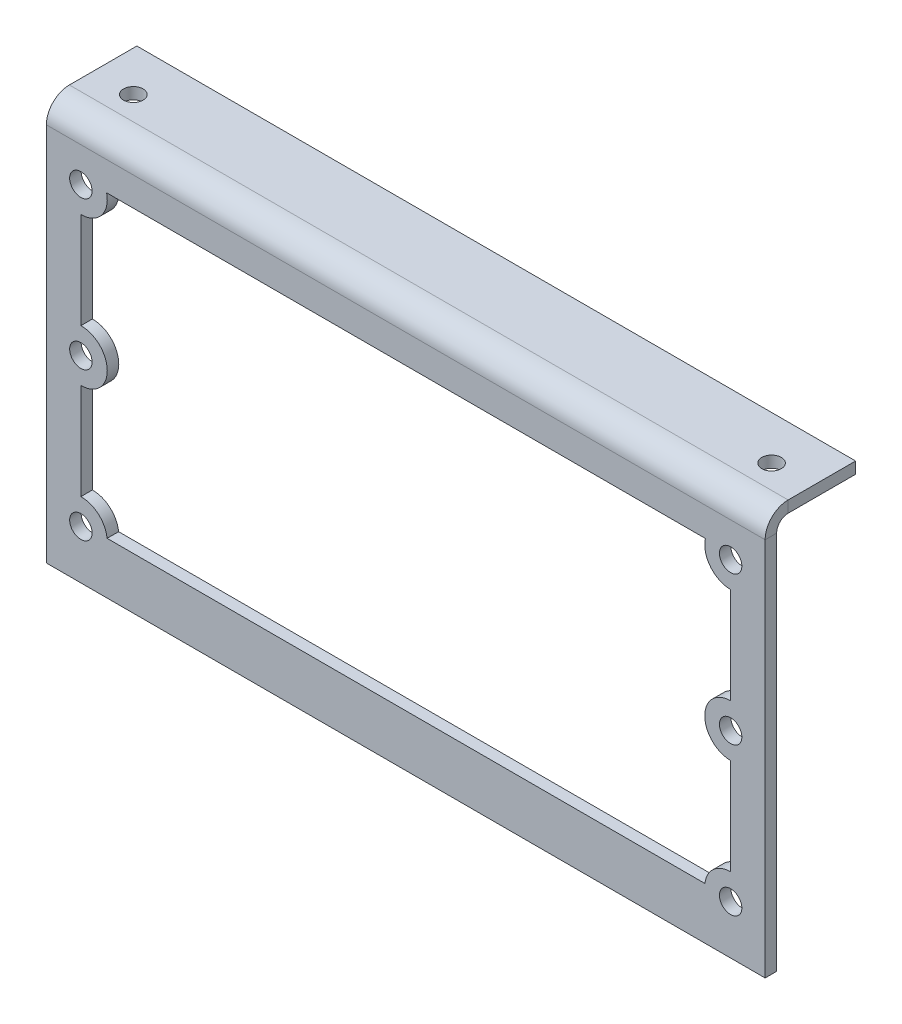
ISO-10303-21;
HEADER;
FILE_DESCRIPTION(('STEP AP214'),'2;1');
FILE_NAME('part.step','',(''),(''),'','','');
FILE_SCHEMA(('AUTOMOTIVE_DESIGN { 1 0 10303 214 1 1 1 1 }'));
ENDSEC;
DATA;
#1=APPLICATION_CONTEXT('core data for automotive mechanical design processes');
#2=APPLICATION_PROTOCOL_DEFINITION('international standard','automotive_design',2000,#1);
#3=PRODUCT_CONTEXT('',#1,'mechanical');
#4=PRODUCT('Part','Part','',(#3));
#5=PRODUCT_RELATED_PRODUCT_CATEGORY('part','',(#4));
#6=PRODUCT_DEFINITION_FORMATION('','',#4);
#7=PRODUCT_DEFINITION_CONTEXT('part definition',#1,'design');
#8=PRODUCT_DEFINITION('design','',#6,#7);
#9=PRODUCT_DEFINITION_SHAPE('','',#8);
#10=(LENGTH_UNIT() NAMED_UNIT(*) SI_UNIT(.MILLI.,.METRE.));
#11=(NAMED_UNIT(*) PLANE_ANGLE_UNIT() SI_UNIT($,.RADIAN.));
#12=(NAMED_UNIT(*) SI_UNIT($,.STERADIAN.) SOLID_ANGLE_UNIT());
#13=UNCERTAINTY_MEASURE_WITH_UNIT(LENGTH_MEASURE(1.E-05),#10,'distance_accuracy_value','');
#14=(GEOMETRIC_REPRESENTATION_CONTEXT(3) GLOBAL_UNCERTAINTY_ASSIGNED_CONTEXT((#13)) GLOBAL_UNIT_ASSIGNED_CONTEXT((#10,
#11,#12)) REPRESENTATION_CONTEXT('',''));
#15=CARTESIAN_POINT('',(0.,0.,0.));
#16=DIRECTION('',(0.,0.,1.));
#17=DIRECTION('',(1.,0.,0.));
#18=AXIS2_PLACEMENT_3D('',#15,#16,#17);
#19=CARTESIAN_POINT('',(0.,0.,0.));
#20=DIRECTION('',(0.,0.,1.));
#21=DIRECTION('',(1.,0.,0.));
#22=AXIS2_PLACEMENT_3D('',#19,#20,#21);
#23=PLANE('',#22);
#24=CARTESIAN_POINT('',(-57.2810987620652,-12.9476395905142,0.));
#25=DIRECTION('',(0.,0.,-1.));
#26=DIRECTION('',(-1.,0.,0.));
#27=AXIS2_PLACEMENT_3D('',#24,#25,#26);
#28=CIRCLE('',#27,1.95);
#29=CARTESIAN_POINT('',(-59.2310987620652,-12.9476395905142,0.));
#30=VERTEX_POINT('',#29);
#31=EDGE_CURVE('E670',#30,#30,#28,.T.);
#32=ORIENTED_EDGE('',*,*,#31,.T.);
#33=EDGE_LOOP('',(#32));
#34=FACE_BOUND('',#33,.T.);
#35=CARTESIAN_POINT('',(-57.2810987620652,12.8023604094858,0.));
#36=DIRECTION('',(0.,0.,-1.));
#37=DIRECTION('',(-1.,0.,0.));
#38=AXIS2_PLACEMENT_3D('',#35,#36,#37);
#39=CIRCLE('',#38,1.95);
#40=CARTESIAN_POINT('',(-59.2310987620652,12.8023604094858,0.));
#41=VERTEX_POINT('',#40);
#42=EDGE_CURVE('E680',#41,#41,#39,.T.);
#43=ORIENTED_EDGE('',*,*,#42,.T.);
#44=EDGE_LOOP('',(#43));
#45=FACE_BOUND('',#44,.T.);
#46=CARTESIAN_POINT('',(-57.2810987620652,38.5523604094858,0.));
#47=DIRECTION('',(0.,0.,-1.));
#48=DIRECTION('',(-1.,0.,0.));
#49=AXIS2_PLACEMENT_3D('',#46,#47,#48);
#50=CIRCLE('',#49,1.95);
#51=CARTESIAN_POINT('',(-59.2310987620652,38.5523604094858,0.));
#52=VERTEX_POINT('',#51);
#53=EDGE_CURVE('E686',#52,#52,#50,.T.);
#54=ORIENTED_EDGE('',*,*,#53,.T.);
#55=EDGE_LOOP('',(#54));
#56=FACE_BOUND('',#55,.T.);
#57=DIRECTION('',(0.,1.,0.));
#58=VECTOR('',#57,1.);
#59=CARTESIAN_POINT('',(61.7189012379343,48.5523604094752,0.));
#60=LINE('',#59,#58);
#61=CARTESIAN_POINT('',(61.7189012379343,-21.4476395905248,0.));
#62=VERTEX_POINT('',#61);
#63=CARTESIAN_POINT('',(61.7189012379343,44.5523604094752,0.));
#64=VERTEX_POINT('',#63);
#65=EDGE_CURVE('E321',#62,#64,#60,.T.);
#66=ORIENTED_EDGE('',*,*,#65,.T.);
#67=DIRECTION('',(1.,0.,0.));
#68=VECTOR('',#67,1.);
#69=CARTESIAN_POINT('',(61.7189012379343,44.5523604094752,0.));
#70=LINE('',#69,#68);
#71=CARTESIAN_POINT('',(-63.2810987620657,44.5523604094752,0.));
#72=VERTEX_POINT('',#71);
#73=EDGE_CURVE('E295',#64,#72,#70,.F.);
#74=ORIENTED_EDGE('',*,*,#73,.T.);
#75=DIRECTION('',(0.,-1.,0.));
#76=VECTOR('',#75,1.);
#77=CARTESIAN_POINT('',(-63.2810987620657,48.5523604094752,0.));
#78=LINE('',#77,#76);
#79=CARTESIAN_POINT('',(-63.2810987620657,-21.4476395905248,0.));
#80=VERTEX_POINT('',#79);
#81=EDGE_CURVE('E315',#72,#80,#78,.T.);
#82=ORIENTED_EDGE('',*,*,#81,.T.);
#83=DIRECTION('',(1.,0.,0.));
#84=VECTOR('',#83,1.);
#85=CARTESIAN_POINT('',(-63.2810987620657,-21.4476395905248,0.));
#86=LINE('',#85,#84);
#87=EDGE_CURVE('E329',#80,#62,#86,.T.);
#88=ORIENTED_EDGE('',*,*,#87,.T.);
#89=EDGE_LOOP('',(#66,#74,#82,#88));
#90=FACE_BOUND('',#89,.T.);
#91=DIRECTION('',(0.,1.,0.));
#92=VECTOR('',#91,1.);
#93=CARTESIAN_POINT('',(55.7189012379343,0.,0.));
#94=LINE('',#93,#92);
#95=CARTESIAN_POINT('',(55.7189012379343,17.3023604094752,0.));
#96=VERTEX_POINT('',#95);
#97=CARTESIAN_POINT('',(55.7189012379343,34.0523604094752,0.));
#98=VERTEX_POINT('',#97);
#99=EDGE_CURVE('E195',#96,#98,#94,.T.);
#100=ORIENTED_EDGE('',*,*,#99,.F.);
#101=CARTESIAN_POINT('',(55.7189012379344,12.8023604094752,0.));
#102=DIRECTION('',(0.,0.,1.));
#103=DIRECTION('',(1.,0.,0.));
#104=AXIS2_PLACEMENT_3D('',#101,#102,#103);
#105=CIRCLE('',#104,4.5);
#106=CARTESIAN_POINT('',(55.7189012379343,8.30236040947521,0.));
#107=VERTEX_POINT('',#106);
#108=EDGE_CURVE('E199',#96,#107,#105,.T.);
#109=ORIENTED_EDGE('',*,*,#108,.T.);
#110=CARTESIAN_POINT('',(55.7189012379343,-8.4476395905248,0.));
#111=VERTEX_POINT('',#110);
#112=EDGE_CURVE('E203',#111,#107,#94,.T.);
#113=ORIENTED_EDGE('',*,*,#112,.F.);
#114=CARTESIAN_POINT('',(55.7189012379344,-12.9476395905248,0.));
#115=DIRECTION('',(0.,0.,1.));
#116=DIRECTION('',(1.,0.,0.));
#117=AXIS2_PLACEMENT_3D('',#114,#115,#116);
#118=CIRCLE('',#117,4.5);
#119=CARTESIAN_POINT('',(51.2467652829348,-12.4476395905248,0.));
#120=VERTEX_POINT('',#119);
#121=EDGE_CURVE('E225',#111,#120,#118,.T.);
#122=ORIENTED_EDGE('',*,*,#121,.T.);
#123=DIRECTION('',(1.,0.,0.));
#124=VECTOR('',#123,1.);
#125=CARTESIAN_POINT('',(0.,-12.4476395905248,0.));
#126=LINE('',#125,#124);
#127=CARTESIAN_POINT('',(-52.7193193116163,-12.4476395905248,0.));
#128=VERTEX_POINT('',#127);
#129=EDGE_CURVE('E336',#128,#120,#126,.T.);
#130=ORIENTED_EDGE('',*,*,#129,.F.);
#131=CARTESIAN_POINT('',(-57.1914552666159,-12.9476395905248,0.));
#132=DIRECTION('',(0.,0.,1.));
#133=DIRECTION('',(1.,0.,0.));
#134=AXIS2_PLACEMENT_3D('',#131,#132,#133);
#135=CIRCLE('',#134,4.5);
#136=CARTESIAN_POINT('',(-57.2810987620657,-8.44853256315553,0.));
#137=VERTEX_POINT('',#136);
#138=EDGE_CURVE('E233',#128,#137,#135,.T.);
#139=ORIENTED_EDGE('',*,*,#138,.T.);
#140=DIRECTION('',(0.,-1.,0.));
#141=VECTOR('',#140,1.);
#142=CARTESIAN_POINT('',(-57.2810987620657,0.,0.));
#143=LINE('',#142,#141);
#144=CARTESIAN_POINT('',(-57.2810987620657,8.30325338210593,0.));
#145=VERTEX_POINT('',#144);
#146=EDGE_CURVE('E340',#145,#137,#143,.T.);
#147=ORIENTED_EDGE('',*,*,#146,.F.);
#148=CARTESIAN_POINT('',(-57.1914552666159,12.8023604094752,0.));
#149=DIRECTION('',(0.,0.,1.));
#150=DIRECTION('',(1.,0.,0.));
#151=AXIS2_PLACEMENT_3D('',#148,#149,#150);
#152=CIRCLE('',#151,4.5);
#153=CARTESIAN_POINT('',(-57.2810987620657,17.3014674368445,0.));
#154=VERTEX_POINT('',#153);
#155=EDGE_CURVE('E249',#145,#154,#152,.T.);
#156=ORIENTED_EDGE('',*,*,#155,.T.);
#157=CARTESIAN_POINT('',(-57.2810987620657,34.0532533821059,0.));
#158=VERTEX_POINT('',#157);
#159=EDGE_CURVE('E341',#158,#154,#143,.T.);
#160=ORIENTED_EDGE('',*,*,#159,.F.);
#161=CARTESIAN_POINT('',(-57.1914552666159,38.5523604094752,0.));
#162=DIRECTION('',(0.,0.,1.));
#163=DIRECTION('',(1.,0.,0.));
#164=AXIS2_PLACEMENT_3D('',#161,#162,#163);
#165=CIRCLE('',#164,4.5);
#166=CARTESIAN_POINT('',(-52.8039730729198,39.5523604094752,0.));
#167=VERTEX_POINT('',#166);
#168=EDGE_CURVE('E241',#158,#167,#165,.T.);
#169=ORIENTED_EDGE('',*,*,#168,.T.);
#170=DIRECTION('',(-1.,0.,0.));
#171=VECTOR('',#170,1.);
#172=CARTESIAN_POINT('',(0.,39.5523604094752,0.));
#173=LINE('',#172,#171);
#174=CARTESIAN_POINT('',(51.3314190442383,39.5523604094752,0.));
#175=VERTEX_POINT('',#174);
#176=EDGE_CURVE('E204',#175,#167,#173,.T.);
#177=ORIENTED_EDGE('',*,*,#176,.F.);
#178=CARTESIAN_POINT('',(55.7189012379344,38.5523604094752,0.));
#179=DIRECTION('',(0.,0.,1.));
#180=DIRECTION('',(1.,0.,0.));
#181=AXIS2_PLACEMENT_3D('',#178,#179,#180);
#182=CIRCLE('',#181,4.5);
#183=EDGE_CURVE('E201',#175,#98,#182,.T.);
#184=ORIENTED_EDGE('',*,*,#183,.T.);
#185=EDGE_LOOP('',(#100,#109,#113,#122,#130,#139,#147,#156,#160,#169,#177,#184));
#186=FACE_BOUND('',#185,.T.);
#187=CARTESIAN_POINT('',(55.7189012379349,-12.9476395905142,0.));
#188=DIRECTION('',(0.,0.,-1.));
#189=DIRECTION('',(-1.,0.,0.));
#190=AXIS2_PLACEMENT_3D('',#187,#188,#189);
#191=CIRCLE('',#190,1.95);
#192=CARTESIAN_POINT('',(53.7689012379349,-12.9476395905142,0.));
#193=VERTEX_POINT('',#192);
#194=EDGE_CURVE('E704',#193,#193,#191,.T.);
#195=ORIENTED_EDGE('',*,*,#194,.T.);
#196=EDGE_LOOP('',(#195));
#197=FACE_BOUND('',#196,.T.);
#198=CARTESIAN_POINT('',(55.7189012379349,12.8023604094858,0.));
#199=DIRECTION('',(0.,0.,-1.));
#200=DIRECTION('',(-1.,0.,0.));
#201=AXIS2_PLACEMENT_3D('',#198,#199,#200);
#202=CIRCLE('',#201,1.95);
#203=CARTESIAN_POINT('',(53.7689012379349,12.8023604094858,0.));
#204=VERTEX_POINT('',#203);
#205=EDGE_CURVE('E698',#204,#204,#202,.T.);
#206=ORIENTED_EDGE('',*,*,#205,.T.);
#207=EDGE_LOOP('',(#206));
#208=FACE_BOUND('',#207,.T.);
#209=CARTESIAN_POINT('',(55.7189012379349,38.5523604094858,0.));
#210=DIRECTION('',(0.,0.,-1.));
#211=DIRECTION('',(-1.,0.,0.));
#212=AXIS2_PLACEMENT_3D('',#209,#210,#211);
#213=CIRCLE('',#212,1.95);
#214=CARTESIAN_POINT('',(53.7689012379349,38.5523604094858,0.));
#215=VERTEX_POINT('',#214);
#216=EDGE_CURVE('E692',#215,#215,#213,.T.);
#217=ORIENTED_EDGE('',*,*,#216,.T.);
#218=EDGE_LOOP('',(#217));
#219=FACE_BOUND('',#218,.T.);
#220=ADVANCED_FACE('F59',(#34,#45,#56,#90,#186,#197,#208,#219),#23,.T.);
#221=CARTESIAN_POINT('',(0.,0.,-2.));
#222=DIRECTION('',(0.,0.,1.));
#223=DIRECTION('',(1.,0.,0.));
#224=AXIS2_PLACEMENT_3D('',#221,#222,#223);
#225=PLANE('',#224);
#226=CARTESIAN_POINT('',(-57.2810987620652,-12.9476395905142,-1.99999999999945));
#227=DIRECTION('',(0.,0.,-1.));
#228=DIRECTION('',(-1.,0.,0.));
#229=AXIS2_PLACEMENT_3D('',#226,#227,#228);
#230=CIRCLE('',#229,1.95);
#231=CARTESIAN_POINT('',(-59.2310987620652,-12.9476395905142,-1.99999999999945));
#232=VERTEX_POINT('',#231);
#233=EDGE_CURVE('E673',#232,#232,#230,.T.);
#234=ORIENTED_EDGE('',*,*,#233,.F.);
#235=EDGE_LOOP('',(#234));
#236=FACE_BOUND('',#235,.T.);
#237=CARTESIAN_POINT('',(-57.2810987620652,12.8023604094858,-1.99999999999945));
#238=DIRECTION('',(0.,0.,-1.));
#239=DIRECTION('',(-1.,0.,0.));
#240=AXIS2_PLACEMENT_3D('',#237,#238,#239);
#241=CIRCLE('',#240,1.95);
#242=CARTESIAN_POINT('',(-59.2310987620652,12.8023604094858,-1.99999999999945));
#243=VERTEX_POINT('',#242);
#244=EDGE_CURVE('E675',#243,#243,#241,.T.);
#245=ORIENTED_EDGE('',*,*,#244,.F.);
#246=EDGE_LOOP('',(#245));
#247=FACE_BOUND('',#246,.T.);
#248=CARTESIAN_POINT('',(-57.2810987620652,38.5523604094858,-1.99999999999945));
#249=DIRECTION('',(0.,0.,-1.));
#250=DIRECTION('',(-1.,0.,0.));
#251=AXIS2_PLACEMENT_3D('',#248,#249,#250);
#252=CIRCLE('',#251,1.95);
#253=CARTESIAN_POINT('',(-59.2310987620652,38.5523604094858,-1.99999999999945));
#254=VERTEX_POINT('',#253);
#255=EDGE_CURVE('E683',#254,#254,#252,.T.);
#256=ORIENTED_EDGE('',*,*,#255,.F.);
#257=EDGE_LOOP('',(#256));
#258=FACE_BOUND('',#257,.T.);
#259=CARTESIAN_POINT('',(55.7189012379349,38.5523604094858,-1.99999999999945));
#260=DIRECTION('',(0.,0.,-1.));
#261=DIRECTION('',(-1.,0.,0.));
#262=AXIS2_PLACEMENT_3D('',#259,#260,#261);
#263=CIRCLE('',#262,1.95);
#264=CARTESIAN_POINT('',(53.7689012379349,38.5523604094858,-1.99999999999945));
#265=VERTEX_POINT('',#264);
#266=EDGE_CURVE('E689',#265,#265,#263,.T.);
#267=ORIENTED_EDGE('',*,*,#266,.F.);
#268=EDGE_LOOP('',(#267));
#269=FACE_BOUND('',#268,.T.);
#270=CARTESIAN_POINT('',(55.7189012379349,12.8023604094858,-1.99999999999945));
#271=DIRECTION('',(0.,0.,-1.));
#272=DIRECTION('',(-1.,0.,0.));
#273=AXIS2_PLACEMENT_3D('',#270,#271,#272);
#274=CIRCLE('',#273,1.95);
#275=CARTESIAN_POINT('',(53.7689012379349,12.8023604094858,-1.99999999999945));
#276=VERTEX_POINT('',#275);
#277=EDGE_CURVE('E695',#276,#276,#274,.T.);
#278=ORIENTED_EDGE('',*,*,#277,.F.);
#279=EDGE_LOOP('',(#278));
#280=FACE_BOUND('',#279,.T.);
#281=DIRECTION('',(0.,-1.,0.));
#282=VECTOR('',#281,1.);
#283=CARTESIAN_POINT('',(55.7189012379343,39.5523604094752,-2.00000000000089));
#284=LINE('',#283,#282);
#285=CARTESIAN_POINT('',(55.7189012379343,8.30236040947521,-2.00000000000089));
#286=VERTEX_POINT('',#285);
#287=CARTESIAN_POINT('',(55.7189012379343,-8.4476395905248,-2.00000000000089));
#288=VERTEX_POINT('',#287);
#289=EDGE_CURVE('E253',#286,#288,#284,.T.);
#290=ORIENTED_EDGE('',*,*,#289,.F.);
#291=CARTESIAN_POINT('',(55.7189012379344,12.8023604094752,-2.));
#292=DIRECTION('',(0.,0.,1.));
#293=DIRECTION('',(1.,0.,0.));
#294=AXIS2_PLACEMENT_3D('',#291,#292,#293);
#295=CIRCLE('',#294,4.5);
#296=CARTESIAN_POINT('',(55.7189012379343,17.3023604094752,-2.00000000000089));
#297=VERTEX_POINT('',#296);
#298=EDGE_CURVE('E211',#297,#286,#295,.T.);
#299=ORIENTED_EDGE('',*,*,#298,.F.);
#300=CARTESIAN_POINT('',(55.7189012379343,34.0523604094752,-2.00000000000089));
#301=VERTEX_POINT('',#300);
#302=EDGE_CURVE('E80',#301,#297,#284,.T.);
#303=ORIENTED_EDGE('',*,*,#302,.F.);
#304=CARTESIAN_POINT('',(55.7189012379344,38.5523604094752,-2.));
#305=DIRECTION('',(0.,0.,1.));
#306=DIRECTION('',(1.,0.,0.));
#307=AXIS2_PLACEMENT_3D('',#304,#305,#306);
#308=CIRCLE('',#307,4.5);
#309=CARTESIAN_POINT('',(51.3314190442383,39.5523604094752,-2.00000000000089));
#310=VERTEX_POINT('',#309);
#311=EDGE_CURVE('E219',#310,#301,#308,.T.);
#312=ORIENTED_EDGE('',*,*,#311,.F.);
#313=DIRECTION('',(1.,0.,0.));
#314=VECTOR('',#313,1.);
#315=CARTESIAN_POINT('',(55.7189012379343,39.5523604094752,-2.00000000000089));
#316=LINE('',#315,#314);
#317=CARTESIAN_POINT('',(-52.8039730729198,39.5523604094752,-2.00000000000089));
#318=VERTEX_POINT('',#317);
#319=EDGE_CURVE('E262',#318,#310,#316,.T.);
#320=ORIENTED_EDGE('',*,*,#319,.F.);
#321=CARTESIAN_POINT('',(-57.1914552666159,38.5523604094752,-2.));
#322=DIRECTION('',(0.,0.,1.));
#323=DIRECTION('',(1.,0.,0.));
#324=AXIS2_PLACEMENT_3D('',#321,#322,#323);
#325=CIRCLE('',#324,4.5);
#326=CARTESIAN_POINT('',(-57.2810987620657,34.0532533821059,-2.00000000000089));
#327=VERTEX_POINT('',#326);
#328=EDGE_CURVE('E242',#327,#318,#325,.T.);
#329=ORIENTED_EDGE('',*,*,#328,.F.);
#330=DIRECTION('',(0.,1.,0.));
#331=VECTOR('',#330,1.);
#332=CARTESIAN_POINT('',(-57.2810987620657,39.5523604094752,-2.00000000000089));
#333=LINE('',#332,#331);
#334=CARTESIAN_POINT('',(-57.2810987620657,17.3014674368445,-2.00000000000089));
#335=VERTEX_POINT('',#334);
#336=EDGE_CURVE('E259',#335,#327,#333,.T.);
#337=ORIENTED_EDGE('',*,*,#336,.F.);
#338=CARTESIAN_POINT('',(-57.1914552666159,12.8023604094752,-2.));
#339=DIRECTION('',(0.,0.,1.));
#340=DIRECTION('',(1.,0.,0.));
#341=AXIS2_PLACEMENT_3D('',#338,#339,#340);
#342=CIRCLE('',#341,4.5);
#343=CARTESIAN_POINT('',(-57.2810987620657,8.30325338210593,-2.00000000000089));
#344=VERTEX_POINT('',#343);
#345=EDGE_CURVE('E250',#344,#335,#342,.T.);
#346=ORIENTED_EDGE('',*,*,#345,.F.);
#347=CARTESIAN_POINT('',(-57.2810987620657,-8.44853256315553,-2.));
#348=VERTEX_POINT('',#347);
#349=EDGE_CURVE('E260',#348,#344,#333,.T.);
#350=ORIENTED_EDGE('',*,*,#349,.F.);
#351=CARTESIAN_POINT('',(-57.1914552666159,-12.9476395905248,-2.));
#352=DIRECTION('',(0.,0.,1.));
#353=DIRECTION('',(1.,0.,0.));
#354=AXIS2_PLACEMENT_3D('',#351,#352,#353);
#355=CIRCLE('',#354,4.5);
#356=CARTESIAN_POINT('',(-52.7193193116163,-12.4476395905248,-2.00000000000089));
#357=VERTEX_POINT('',#356);
#358=EDGE_CURVE('E234',#357,#348,#355,.T.);
#359=ORIENTED_EDGE('',*,*,#358,.F.);
#360=DIRECTION('',(-1.,0.,0.));
#361=VECTOR('',#360,1.);
#362=CARTESIAN_POINT('',(55.7189012379343,-12.4476395905248,-2.00000000000089));
#363=LINE('',#362,#361);
#364=CARTESIAN_POINT('',(51.2467652829348,-12.4476395905248,-2.00000000000089));
#365=VERTEX_POINT('',#364);
#366=EDGE_CURVE('E257',#365,#357,#363,.T.);
#367=ORIENTED_EDGE('',*,*,#366,.F.);
#368=CARTESIAN_POINT('',(55.7189012379344,-12.9476395905248,-2.));
#369=DIRECTION('',(0.,0.,1.));
#370=DIRECTION('',(1.,0.,0.));
#371=AXIS2_PLACEMENT_3D('',#368,#369,#370);
#372=CIRCLE('',#371,4.5);
#373=EDGE_CURVE('E226',#288,#365,#372,.T.);
#374=ORIENTED_EDGE('',*,*,#373,.F.);
#375=EDGE_LOOP('',(#290,#299,#303,#312,#320,#329,#337,#346,#350,#359,#367,#374));
#376=FACE_BOUND('',#375,.T.);
#377=DIRECTION('',(1.,0.,0.));
#378=VECTOR('',#377,1.);
#379=CARTESIAN_POINT('',(61.7189012379343,44.5523604094752,-2.));
#380=LINE('',#379,#378);
#381=CARTESIAN_POINT('',(61.7189012379343,44.5523604094752,-2.));
#382=VERTEX_POINT('',#381);
#383=CARTESIAN_POINT('',(-63.2810987620657,44.5523604094752,-2.));
#384=VERTEX_POINT('',#383);
#385=EDGE_CURVE('E308',#382,#384,#380,.F.);
#386=ORIENTED_EDGE('',*,*,#385,.F.);
#387=DIRECTION('',(0.,1.,0.));
#388=VECTOR('',#387,1.);
#389=CARTESIAN_POINT('',(61.7189012379343,48.5523604094752,-2.));
#390=LINE('',#389,#388);
#391=CARTESIAN_POINT('',(61.7189012379343,-21.4476395905248,-2.));
#392=VERTEX_POINT('',#391);
#393=EDGE_CURVE('E324',#392,#382,#390,.T.);
#394=ORIENTED_EDGE('',*,*,#393,.F.);
#395=DIRECTION('',(1.,0.,0.));
#396=VECTOR('',#395,1.);
#397=CARTESIAN_POINT('',(-63.2810987620657,-21.4476395905248,-2.));
#398=LINE('',#397,#396);
#399=CARTESIAN_POINT('',(-63.2810987620657,-21.4476395905248,-2.));
#400=VERTEX_POINT('',#399);
#401=EDGE_CURVE('E320',#400,#392,#398,.T.);
#402=ORIENTED_EDGE('',*,*,#401,.F.);
#403=DIRECTION('',(0.,-1.,0.));
#404=VECTOR('',#403,1.);
#405=CARTESIAN_POINT('',(-63.2810987620657,48.5523604094752,-2.));
#406=LINE('',#405,#404);
#407=EDGE_CURVE('E318',#384,#400,#406,.T.);
#408=ORIENTED_EDGE('',*,*,#407,.F.);
#409=EDGE_LOOP('',(#386,#394,#402,#408));
#410=FACE_BOUND('',#409,.T.);
#411=CARTESIAN_POINT('',(55.7189012379349,-12.9476395905142,-1.99999999999945));
#412=DIRECTION('',(0.,0.,-1.));
#413=DIRECTION('',(-1.,0.,0.));
#414=AXIS2_PLACEMENT_3D('',#411,#412,#413);
#415=CIRCLE('',#414,1.95);
#416=CARTESIAN_POINT('',(53.7689012379349,-12.9476395905142,-1.99999999999945));
#417=VERTEX_POINT('',#416);
#418=EDGE_CURVE('E701',#417,#417,#415,.T.);
#419=ORIENTED_EDGE('',*,*,#418,.F.);
#420=EDGE_LOOP('',(#419));
#421=FACE_BOUND('',#420,.T.);
#422=ADVANCED_FACE('F368',(#236,#247,#258,#269,#280,#376,#410,#421),#225,.F.);
#423=CARTESIAN_POINT('',(55.7189012379343,39.5523604094752,7.99999999999911));
#424=DIRECTION('',(1.,0.,0.));
#425=DIRECTION('',(0.,0.,-1.));
#426=AXIS2_PLACEMENT_3D('',#423,#424,#425);
#427=PLANE('',#426);
#428=ORIENTED_EDGE('',*,*,#302,.T.);
#429=DIRECTION('',(0.,0.,1.));
#430=VECTOR('',#429,1.);
#431=CARTESIAN_POINT('',(55.7189012379343,17.3023604094752,-2.));
#432=LINE('',#431,#430);
#433=EDGE_CURVE('E13',#297,#96,#432,.T.);
#434=ORIENTED_EDGE('',*,*,#433,.T.);
#435=ORIENTED_EDGE('',*,*,#99,.T.);
#436=DIRECTION('',(0.,0.,1.));
#437=VECTOR('',#436,1.);
#438=CARTESIAN_POINT('',(55.7189012379343,34.0523604094752,-2.));
#439=LINE('',#438,#437);
#440=EDGE_CURVE('E222',#98,#301,#439,.F.);
#441=ORIENTED_EDGE('',*,*,#440,.T.);
#442=EDGE_LOOP('',(#428,#434,#435,#441));
#443=FACE_BOUND('',#442,.T.);
#444=ADVANCED_FACE('F206',(#443),#427,.F.);
#445=CARTESIAN_POINT('',(-57.2810987620657,39.5523604094752,7.99999999999911));
#446=DIRECTION('',(-1.,0.,0.));
#447=DIRECTION('',(0.,0.,1.));
#448=AXIS2_PLACEMENT_3D('',#445,#446,#447);
#449=PLANE('',#448);
#450=ORIENTED_EDGE('',*,*,#146,.T.);
#451=DIRECTION('',(0.,0.,1.));
#452=VECTOR('',#451,1.);
#453=CARTESIAN_POINT('',(-57.2810987620657,-8.44853256315553,-2.));
#454=LINE('',#453,#452);
#455=EDGE_CURVE('E237',#137,#348,#454,.F.);
#456=ORIENTED_EDGE('',*,*,#455,.T.);
#457=ORIENTED_EDGE('',*,*,#349,.T.);
#458=DIRECTION('',(0.,0.,1.));
#459=VECTOR('',#458,1.);
#460=CARTESIAN_POINT('',(-57.2810987620657,8.30325338210593,-2.));
#461=LINE('',#460,#459);
#462=EDGE_CURVE('E346',#344,#145,#461,.T.);
#463=ORIENTED_EDGE('',*,*,#462,.T.);
#464=EDGE_LOOP('',(#450,#456,#457,#463));
#465=FACE_BOUND('',#464,.T.);
#466=ADVANCED_FACE('F388',(#465),#449,.F.);
#467=CARTESIAN_POINT('',(61.7189012379343,48.5523604094752,-2.));
#468=DIRECTION('',(1.,0.,0.));
#469=DIRECTION('',(0.,1.,0.));
#470=AXIS2_PLACEMENT_3D('',#467,#468,#469);
#471=PLANE('',#470);
#472=ORIENTED_EDGE('',*,*,#393,.T.);
#473=DIRECTION('',(0.,0.,1.));
#474=VECTOR('',#473,1.);
#475=CARTESIAN_POINT('',(61.7189012379343,44.5523604094752,-2.));
#476=LINE('',#475,#474);
#477=EDGE_CURVE('E302',#382,#64,#476,.T.);
#478=ORIENTED_EDGE('',*,*,#477,.T.);
#479=ORIENTED_EDGE('',*,*,#65,.F.);
#480=DIRECTION('',(0.,0.,1.));
#481=VECTOR('',#480,1.);
#482=CARTESIAN_POINT('',(61.7189012379343,-21.4476395905248,-2.));
#483=LINE('',#482,#481);
#484=EDGE_CURVE('E334',#392,#62,#483,.T.);
#485=ORIENTED_EDGE('',*,*,#484,.F.);
#486=EDGE_LOOP('',(#472,#478,#479,#485));
#487=FACE_BOUND('',#486,.T.);
#488=ADVANCED_FACE('F423',(#487),#471,.T.);
#489=CARTESIAN_POINT('',(-63.2810987620657,48.5523604094752,-2.));
#490=DIRECTION('',(-1.,0.,0.));
#491=DIRECTION('',(0.,0.,1.));
#492=AXIS2_PLACEMENT_3D('',#489,#490,#491);
#493=PLANE('',#492);
#494=DIRECTION('',(0.,0.,1.));
#495=VECTOR('',#494,1.);
#496=CARTESIAN_POINT('',(-63.2810987620657,44.5523604094752,-2.));
#497=LINE('',#496,#495);
#498=EDGE_CURVE('E312',#384,#72,#497,.T.);
#499=ORIENTED_EDGE('',*,*,#498,.F.);
#500=ORIENTED_EDGE('',*,*,#407,.T.);
#501=DIRECTION('',(0.,0.,1.));
#502=VECTOR('',#501,1.);
#503=CARTESIAN_POINT('',(-63.2810987620657,-21.4476395905248,-2.));
#504=LINE('',#503,#502);
#505=EDGE_CURVE('E327',#400,#80,#504,.T.);
#506=ORIENTED_EDGE('',*,*,#505,.T.);
#507=ORIENTED_EDGE('',*,*,#81,.F.);
#508=EDGE_LOOP('',(#499,#500,#506,#507));
#509=FACE_BOUND('',#508,.T.);
#510=ADVANCED_FACE('F61',(#509),#493,.T.);
#511=CARTESIAN_POINT('',(-63.2810987620657,-21.4476395905248,-2.));
#512=DIRECTION('',(0.,-1.,0.));
#513=DIRECTION('',(0.,0.,-1.));
#514=AXIS2_PLACEMENT_3D('',#511,#512,#513);
#515=PLANE('',#514);
#516=ORIENTED_EDGE('',*,*,#87,.F.);
#517=ORIENTED_EDGE('',*,*,#505,.F.);
#518=ORIENTED_EDGE('',*,*,#401,.T.);
#519=ORIENTED_EDGE('',*,*,#484,.T.);
#520=EDGE_LOOP('',(#516,#517,#518,#519));
#521=FACE_BOUND('',#520,.T.);
#522=ADVANCED_FACE('F426',(#521),#515,.T.);
#523=CARTESIAN_POINT('',(-63.2810987620657,44.5523604094752,-4.));
#524=DIRECTION('',(-1.,0.,0.));
#525=DIRECTION('',(0.,0.,1.));
#526=AXIS2_PLACEMENT_3D('',#523,#524,#525);
#527=PLANE('',#526);
#528=DIRECTION('',(0.,-1.,0.));
#529=VECTOR('',#528,1.);
#530=CARTESIAN_POINT('',(-63.2810987620657,48.5523604094752,-3.99999999999999));
#531=LINE('',#530,#529);
#532=CARTESIAN_POINT('',(-63.2810987620657,46.5523604094752,-4.));
#533=VERTEX_POINT('',#532);
#534=CARTESIAN_POINT('',(-63.2810987620657,48.5523604094752,-3.99999999999999));
#535=VERTEX_POINT('',#534);
#536=EDGE_CURVE('E264',#533,#535,#531,.F.);
#537=ORIENTED_EDGE('',*,*,#536,.F.);
#538=CARTESIAN_POINT('',(-63.2810987620657,44.5523604094752,-4.));
#539=DIRECTION('',(1.,0.,0.));
#540=DIRECTION('',(0.,0.,-1.));
#541=AXIS2_PLACEMENT_3D('',#538,#539,#540);
#542=CIRCLE('',#541,2.);
#543=EDGE_CURVE('E305',#384,#533,#542,.F.);
#544=ORIENTED_EDGE('',*,*,#543,.F.);
#545=ORIENTED_EDGE('',*,*,#498,.T.);
#546=CARTESIAN_POINT('',(-63.2810987620657,44.5523604094752,-4.));
#547=DIRECTION('',(1.,0.,0.));
#548=DIRECTION('',(0.,0.,-1.));
#549=AXIS2_PLACEMENT_3D('',#546,#547,#548);
#550=CIRCLE('',#549,4.);
#551=EDGE_CURVE('E298',#72,#535,#550,.F.);
#552=ORIENTED_EDGE('',*,*,#551,.T.);
#553=EDGE_LOOP('',(#537,#544,#545,#552));
#554=FACE_BOUND('',#553,.T.);
#555=ADVANCED_FACE('F428',(#554),#527,.T.);
#556=CARTESIAN_POINT('',(61.7189012379343,44.5523604094752,-4.));
#557=DIRECTION('',(-1.,0.,0.));
#558=DIRECTION('',(0.,0.,1.));
#559=AXIS2_PLACEMENT_3D('',#556,#557,#558);
#560=PLANE('',#559);
#561=CARTESIAN_POINT('',(61.7189012379343,44.5523604094752,-4.));
#562=DIRECTION('',(1.,0.,0.));
#563=DIRECTION('',(0.,0.,-1.));
#564=AXIS2_PLACEMENT_3D('',#561,#562,#563);
#565=CIRCLE('',#564,2.);
#566=CARTESIAN_POINT('',(61.7189012379343,46.5523604094752,-4.));
#567=VERTEX_POINT('',#566);
#568=EDGE_CURVE('E268',#567,#382,#565,.T.);
#569=ORIENTED_EDGE('',*,*,#568,.F.);
#570=DIRECTION('',(0.,-1.,0.));
#571=VECTOR('',#570,1.);
#572=CARTESIAN_POINT('',(61.7189012379343,46.5523604094752,-4.));
#573=LINE('',#572,#571);
#574=CARTESIAN_POINT('',(61.7189012379343,48.5523604094752,-3.99999999999999));
#575=VERTEX_POINT('',#574);
#576=EDGE_CURVE('E288',#567,#575,#573,.F.);
#577=ORIENTED_EDGE('',*,*,#576,.T.);
#578=CARTESIAN_POINT('',(61.7189012379343,44.5523604094752,-4.));
#579=DIRECTION('',(1.,0.,0.));
#580=DIRECTION('',(0.,0.,-1.));
#581=AXIS2_PLACEMENT_3D('',#578,#579,#580);
#582=CIRCLE('',#581,4.);
#583=EDGE_CURVE('E299',#575,#64,#582,.T.);
#584=ORIENTED_EDGE('',*,*,#583,.T.);
#585=ORIENTED_EDGE('',*,*,#477,.F.);
#586=EDGE_LOOP('',(#569,#577,#584,#585));
#587=FACE_BOUND('',#586,.T.);
#588=ADVANCED_FACE('F434',(#587),#560,.F.);
#589=CARTESIAN_POINT('',(61.7189012379343,44.5523604094752,-4.));
#590=DIRECTION('',(1.,0.,0.));
#591=DIRECTION('',(0.,1.,0.));
#592=AXIS2_PLACEMENT_3D('',#589,#590,#591);
#593=CYLINDRICAL_SURFACE('',#592,4.);
#594=ORIENTED_EDGE('',*,*,#73,.F.);
#595=ORIENTED_EDGE('',*,*,#583,.F.);
#596=DIRECTION('',(1.,0.,0.));
#597=VECTOR('',#596,1.);
#598=CARTESIAN_POINT('',(-63.2810987620657,48.5523604094752,-3.99999999999999));
#599=LINE('',#598,#597);
#600=EDGE_CURVE('E286',#575,#535,#599,.F.);
#601=ORIENTED_EDGE('',*,*,#600,.T.);
#602=ORIENTED_EDGE('',*,*,#551,.F.);
#603=EDGE_LOOP('',(#594,#595,#601,#602));
#604=FACE_BOUND('',#603,.T.);
#605=ADVANCED_FACE('F476',(#604),#593,.T.);
#606=CARTESIAN_POINT('',(61.7189012379343,44.5523604094752,-4.));
#607=DIRECTION('',(1.,0.,0.));
#608=DIRECTION('',(0.,1.,0.));
#609=AXIS2_PLACEMENT_3D('',#606,#607,#608);
#610=CYLINDRICAL_SURFACE('',#609,2.);
#611=ORIENTED_EDGE('',*,*,#385,.T.);
#612=ORIENTED_EDGE('',*,*,#543,.T.);
#613=DIRECTION('',(1.,0.,0.));
#614=VECTOR('',#613,1.);
#615=CARTESIAN_POINT('',(-63.2810987620657,46.5523604094752,-4.));
#616=LINE('',#615,#614);
#617=EDGE_CURVE('E291',#533,#567,#616,.T.);
#618=ORIENTED_EDGE('',*,*,#617,.T.);
#619=ORIENTED_EDGE('',*,*,#568,.T.);
#620=EDGE_LOOP('',(#611,#612,#618,#619));
#621=FACE_BOUND('',#620,.T.);
#622=ADVANCED_FACE('F453',(#621),#610,.F.);
#623=CARTESIAN_POINT('',(61.7189012379343,48.5523604094752,-15.7366));
#624=DIRECTION('',(-1.,0.,0.));
#625=DIRECTION('',(0.,0.,1.));
#626=AXIS2_PLACEMENT_3D('',#623,#624,#625);
#627=PLANE('',#626);
#628=ORIENTED_EDGE('',*,*,#576,.F.);
#629=DIRECTION('',(0.,0.,1.));
#630=VECTOR('',#629,1.);
#631=CARTESIAN_POINT('',(61.7189012379343,46.5523604094752,-15.7366));
#632=LINE('',#631,#630);
#633=CARTESIAN_POINT('',(61.7189012379343,46.5523604094752,-15.7366));
#634=VERTEX_POINT('',#633);
#635=EDGE_CURVE('E284',#567,#634,#632,.F.);
#636=ORIENTED_EDGE('',*,*,#635,.T.);
#637=DIRECTION('',(0.,-1.,0.));
#638=VECTOR('',#637,1.);
#639=CARTESIAN_POINT('',(61.7189012379343,48.5523604094752,-15.7366));
#640=LINE('',#639,#638);
#641=CARTESIAN_POINT('',(61.7189012379343,48.5523604094752,-15.7366));
#642=VERTEX_POINT('',#641);
#643=EDGE_CURVE('E265',#642,#634,#640,.T.);
#644=ORIENTED_EDGE('',*,*,#643,.F.);
#645=DIRECTION('',(0.,0.,-1.));
#646=VECTOR('',#645,1.);
#647=CARTESIAN_POINT('',(61.7189012379343,48.5523604094752,1.78662835692792E-13));
#648=LINE('',#647,#646);
#649=EDGE_CURVE('E277',#575,#642,#648,.T.);
#650=ORIENTED_EDGE('',*,*,#649,.F.);
#651=EDGE_LOOP('',(#628,#636,#644,#650));
#652=FACE_BOUND('',#651,.T.);
#653=ADVANCED_FACE('F471',(#652),#627,.F.);
#654=CARTESIAN_POINT('',(-63.2810987620657,48.5523604094752,-1.99999999999999));
#655=DIRECTION('',(1.,0.,0.));
#656=DIRECTION('',(0.,0.,-1.));
#657=AXIS2_PLACEMENT_3D('',#654,#655,#656);
#658=PLANE('',#657);
#659=ORIENTED_EDGE('',*,*,#536,.T.);
#660=DIRECTION('',(0.,0.,1.));
#661=VECTOR('',#660,1.);
#662=CARTESIAN_POINT('',(-63.2810987620657,48.5523604094752,1.78662835692792E-13));
#663=LINE('',#662,#661);
#664=CARTESIAN_POINT('',(-63.2810987620657,48.5523604094752,-15.7366));
#665=VERTEX_POINT('',#664);
#666=EDGE_CURVE('E272',#665,#535,#663,.T.);
#667=ORIENTED_EDGE('',*,*,#666,.F.);
#668=DIRECTION('',(0.,-1.,0.));
#669=VECTOR('',#668,1.);
#670=CARTESIAN_POINT('',(-63.2810987620657,48.5523604094752,-15.7366));
#671=LINE('',#670,#669);
#672=CARTESIAN_POINT('',(-63.2810987620657,46.5523604094752,-15.7366));
#673=VERTEX_POINT('',#672);
#674=EDGE_CURVE('E269',#665,#673,#671,.T.);
#675=ORIENTED_EDGE('',*,*,#674,.T.);
#676=DIRECTION('',(0.,0.,-1.));
#677=VECTOR('',#676,1.);
#678=CARTESIAN_POINT('',(-63.2810987620657,46.5523604094752,-2.));
#679=LINE('',#678,#677);
#680=EDGE_CURVE('E279',#673,#533,#679,.F.);
#681=ORIENTED_EDGE('',*,*,#680,.T.);
#682=EDGE_LOOP('',(#659,#667,#675,#681));
#683=FACE_BOUND('',#682,.T.);
#684=ADVANCED_FACE('F462',(#683),#658,.F.);
#685=CARTESIAN_POINT('',(0.,48.5523604094752,1.78662835692792E-13));
#686=DIRECTION('',(0.,-1.,0.));
#687=DIRECTION('',(0.,0.,-1.));
#688=AXIS2_PLACEMENT_3D('',#685,#686,#687);
#689=PLANE('',#688);
#690=CARTESIAN_POINT('',(-56.2810987620657,48.5523604094753,-8.11843409958268));
#691=DIRECTION('',(0.,-1.,0.));
#692=DIRECTION('',(0.,0.,-1.));
#693=AXIS2_PLACEMENT_3D('',#690,#691,#692);
#694=CIRCLE('',#693,1.7);
#695=CARTESIAN_POINT('',(-56.2810987620657,48.5523604094753,-9.81843409958268));
#696=VERTEX_POINT('',#695);
#697=EDGE_CURVE('E707',#696,#696,#694,.T.);
#698=ORIENTED_EDGE('',*,*,#697,.T.);
#699=EDGE_LOOP('',(#698));
#700=FACE_BOUND('',#699,.T.);
#701=CARTESIAN_POINT('',(54.7189012379343,48.5523604094753,-8.11843409958268));
#702=DIRECTION('',(0.,-1.,0.));
#703=DIRECTION('',(0.,0.,-1.));
#704=AXIS2_PLACEMENT_3D('',#701,#702,#703);
#705=CIRCLE('',#704,1.7);
#706=CARTESIAN_POINT('',(54.7189012379343,48.5523604094753,-9.81843409958268));
#707=VERTEX_POINT('',#706);
#708=EDGE_CURVE('E216',#707,#707,#705,.T.);
#709=ORIENTED_EDGE('',*,*,#708,.T.);
#710=EDGE_LOOP('',(#709));
#711=FACE_BOUND('',#710,.T.);
#712=ORIENTED_EDGE('',*,*,#600,.F.);
#713=ORIENTED_EDGE('',*,*,#649,.T.);
#714=DIRECTION('',(-1.,0.,0.));
#715=VECTOR('',#714,1.);
#716=CARTESIAN_POINT('',(0.,48.5523604094752,-15.7366));
#717=LINE('',#716,#715);
#718=EDGE_CURVE('E275',#642,#665,#717,.T.);
#719=ORIENTED_EDGE('',*,*,#718,.T.);
#720=ORIENTED_EDGE('',*,*,#666,.T.);
#721=EDGE_LOOP('',(#712,#713,#719,#720));
#722=FACE_BOUND('',#721,.T.);
#723=ADVANCED_FACE('F474',(#700,#711,#722),#689,.F.);
#724=CARTESIAN_POINT('',(0.,46.5523604094752,1.71679873015105E-13));
#725=DIRECTION('',(0.,-1.,0.));
#726=DIRECTION('',(0.,0.,-1.));
#727=AXIS2_PLACEMENT_3D('',#724,#725,#726);
#728=PLANE('',#727);
#729=CARTESIAN_POINT('',(-56.2810987620657,46.5523604094752,-8.11843409958268));
#730=DIRECTION('',(0.,-1.,0.));
#731=DIRECTION('',(0.,0.,-1.));
#732=AXIS2_PLACEMENT_3D('',#729,#730,#731);
#733=CIRCLE('',#732,1.7);
#734=CARTESIAN_POINT('',(-56.2810987620657,46.5523604094752,-9.81843409958268));
#735=VERTEX_POINT('',#734);
#736=EDGE_CURVE('E710',#735,#735,#733,.T.);
#737=ORIENTED_EDGE('',*,*,#736,.F.);
#738=EDGE_LOOP('',(#737));
#739=FACE_BOUND('',#738,.T.);
#740=CARTESIAN_POINT('',(54.7189012379343,46.5523604094752,-8.11843409958268));
#741=DIRECTION('',(0.,-1.,0.));
#742=DIRECTION('',(0.,0.,-1.));
#743=AXIS2_PLACEMENT_3D('',#740,#741,#742);
#744=CIRCLE('',#743,1.7);
#745=CARTESIAN_POINT('',(54.7189012379343,46.5523604094752,-9.81843409958268));
#746=VERTEX_POINT('',#745);
#747=EDGE_CURVE('E212',#746,#746,#744,.T.);
#748=ORIENTED_EDGE('',*,*,#747,.F.);
#749=EDGE_LOOP('',(#748));
#750=FACE_BOUND('',#749,.T.);
#751=ORIENTED_EDGE('',*,*,#635,.F.);
#752=ORIENTED_EDGE('',*,*,#617,.F.);
#753=ORIENTED_EDGE('',*,*,#680,.F.);
#754=DIRECTION('',(1.,0.,0.));
#755=VECTOR('',#754,1.);
#756=CARTESIAN_POINT('',(-63.2810987620657,46.5523604094752,-15.7366));
#757=LINE('',#756,#755);
#758=EDGE_CURVE('E282',#634,#673,#757,.F.);
#759=ORIENTED_EDGE('',*,*,#758,.F.);
#760=EDGE_LOOP('',(#751,#752,#753,#759));
#761=FACE_BOUND('',#760,.T.);
#762=ADVANCED_FACE('F459',(#739,#750,#761),#728,.T.);
#763=CARTESIAN_POINT('',(-63.2810987620657,48.5523604094752,-15.7366));
#764=DIRECTION('',(0.,0.,1.));
#765=DIRECTION('',(0.,-1.,0.));
#766=AXIS2_PLACEMENT_3D('',#763,#764,#765);
#767=PLANE('',#766);
#768=ORIENTED_EDGE('',*,*,#758,.T.);
#769=ORIENTED_EDGE('',*,*,#674,.F.);
#770=ORIENTED_EDGE('',*,*,#718,.F.);
#771=ORIENTED_EDGE('',*,*,#643,.T.);
#772=EDGE_LOOP('',(#768,#769,#770,#771));
#773=FACE_BOUND('',#772,.T.);
#774=ADVANCED_FACE('F467',(#773),#767,.F.);
#775=ORIENTED_EDGE('',*,*,#112,.T.);
#776=DIRECTION('',(0.,0.,1.));
#777=VECTOR('',#776,1.);
#778=CARTESIAN_POINT('',(55.7189012379343,8.3023604094752,-2.));
#779=LINE('',#778,#777);
#780=EDGE_CURVE('E67',#107,#286,#779,.F.);
#781=ORIENTED_EDGE('',*,*,#780,.T.);
#782=ORIENTED_EDGE('',*,*,#289,.T.);
#783=DIRECTION('',(0.,0.,1.));
#784=VECTOR('',#783,1.);
#785=CARTESIAN_POINT('',(55.7189012379343,-8.4476395905248,-2.));
#786=LINE('',#785,#784);
#787=EDGE_CURVE('E229',#288,#111,#786,.T.);
#788=ORIENTED_EDGE('',*,*,#787,.T.);
#789=EDGE_LOOP('',(#775,#781,#782,#788));
#790=FACE_BOUND('',#789,.T.);
#791=ADVANCED_FACE('F373',(#790),#427,.F.);
#792=CARTESIAN_POINT('',(55.7189012379343,39.5523604094752,7.99999999999911));
#793=DIRECTION('',(0.,1.,0.));
#794=DIRECTION('',(0.,0.,1.));
#795=AXIS2_PLACEMENT_3D('',#792,#793,#794);
#796=PLANE('',#795);
#797=ORIENTED_EDGE('',*,*,#319,.T.);
#798=DIRECTION('',(0.,0.,1.));
#799=VECTOR('',#798,1.);
#800=CARTESIAN_POINT('',(51.3314190442383,39.5523604094752,-2.));
#801=LINE('',#800,#799);
#802=EDGE_CURVE('E357',#310,#175,#801,.T.);
#803=ORIENTED_EDGE('',*,*,#802,.T.);
#804=ORIENTED_EDGE('',*,*,#176,.T.);
#805=DIRECTION('',(0.,0.,1.));
#806=VECTOR('',#805,1.);
#807=CARTESIAN_POINT('',(-52.8039730729198,39.5523604094752,-2.));
#808=LINE('',#807,#806);
#809=EDGE_CURVE('E245',#167,#318,#808,.F.);
#810=ORIENTED_EDGE('',*,*,#809,.T.);
#811=EDGE_LOOP('',(#797,#803,#804,#810));
#812=FACE_BOUND('',#811,.T.);
#813=ADVANCED_FACE('F361',(#812),#796,.F.);
#814=ORIENTED_EDGE('',*,*,#336,.T.);
#815=DIRECTION('',(0.,0.,1.));
#816=VECTOR('',#815,1.);
#817=CARTESIAN_POINT('',(-57.2810987620657,34.0532533821059,-2.));
#818=LINE('',#817,#816);
#819=EDGE_CURVE('E349',#327,#158,#818,.T.);
#820=ORIENTED_EDGE('',*,*,#819,.T.);
#821=ORIENTED_EDGE('',*,*,#159,.T.);
#822=DIRECTION('',(0.,0.,1.));
#823=VECTOR('',#822,1.);
#824=CARTESIAN_POINT('',(-57.2810987620657,17.3014674368445,-2.));
#825=LINE('',#824,#823);
#826=EDGE_CURVE('E344',#154,#335,#825,.F.);
#827=ORIENTED_EDGE('',*,*,#826,.T.);
#828=EDGE_LOOP('',(#814,#820,#821,#827));
#829=FACE_BOUND('',#828,.T.);
#830=ADVANCED_FACE('F400',(#829),#449,.F.);
#831=CARTESIAN_POINT('',(55.7189012379343,-12.4476395905248,7.99999999999911));
#832=DIRECTION('',(0.,-1.,0.));
#833=DIRECTION('',(0.,0.,-1.));
#834=AXIS2_PLACEMENT_3D('',#831,#832,#833);
#835=PLANE('',#834);
#836=ORIENTED_EDGE('',*,*,#129,.T.);
#837=DIRECTION('',(0.,0.,1.));
#838=VECTOR('',#837,1.);
#839=CARTESIAN_POINT('',(51.2467652829348,-12.4476395905248,-2.));
#840=LINE('',#839,#838);
#841=EDGE_CURVE('E355',#120,#365,#840,.F.);
#842=ORIENTED_EDGE('',*,*,#841,.T.);
#843=ORIENTED_EDGE('',*,*,#366,.T.);
#844=DIRECTION('',(0.,0.,1.));
#845=VECTOR('',#844,1.);
#846=CARTESIAN_POINT('',(-52.7193193116163,-12.4476395905248,-2.));
#847=LINE('',#846,#845);
#848=EDGE_CURVE('E352',#357,#128,#847,.T.);
#849=ORIENTED_EDGE('',*,*,#848,.T.);
#850=EDGE_LOOP('',(#836,#842,#843,#849));
#851=FACE_BOUND('',#850,.T.);
#852=ADVANCED_FACE('F381',(#851),#835,.F.);
#853=CARTESIAN_POINT('',(-57.1914552666159,12.8023604094752,-2.));
#854=DIRECTION('',(0.,0.,1.));
#855=DIRECTION('',(1.,0.,0.));
#856=AXIS2_PLACEMENT_3D('',#853,#854,#855);
#857=CYLINDRICAL_SURFACE('',#856,4.5);
#858=ORIENTED_EDGE('',*,*,#462,.F.);
#859=ORIENTED_EDGE('',*,*,#345,.T.);
#860=ORIENTED_EDGE('',*,*,#826,.F.);
#861=ORIENTED_EDGE('',*,*,#155,.F.);
#862=EDGE_LOOP('',(#858,#859,#860,#861));
#863=FACE_BOUND('',#862,.T.);
#864=ADVANCED_FACE('F395',(#863),#857,.T.);
#865=CARTESIAN_POINT('',(-57.1914552666159,38.5523604094752,-2.));
#866=DIRECTION('',(0.,0.,1.));
#867=DIRECTION('',(1.,0.,0.));
#868=AXIS2_PLACEMENT_3D('',#865,#866,#867);
#869=CYLINDRICAL_SURFACE('',#868,4.5);
#870=ORIENTED_EDGE('',*,*,#809,.F.);
#871=ORIENTED_EDGE('',*,*,#168,.F.);
#872=ORIENTED_EDGE('',*,*,#819,.F.);
#873=ORIENTED_EDGE('',*,*,#328,.T.);
#874=EDGE_LOOP('',(#870,#871,#872,#873));
#875=FACE_BOUND('',#874,.T.);
#876=ADVANCED_FACE('F402',(#875),#869,.T.);
#877=CARTESIAN_POINT('',(-57.1914552666159,-12.9476395905248,-2.));
#878=DIRECTION('',(0.,0.,1.));
#879=DIRECTION('',(1.,0.,0.));
#880=AXIS2_PLACEMENT_3D('',#877,#878,#879);
#881=CYLINDRICAL_SURFACE('',#880,4.5);
#882=ORIENTED_EDGE('',*,*,#455,.F.);
#883=ORIENTED_EDGE('',*,*,#138,.F.);
#884=ORIENTED_EDGE('',*,*,#848,.F.);
#885=ORIENTED_EDGE('',*,*,#358,.T.);
#886=EDGE_LOOP('',(#882,#883,#884,#885));
#887=FACE_BOUND('',#886,.T.);
#888=ADVANCED_FACE('F385',(#887),#881,.T.);
#889=CARTESIAN_POINT('',(55.7189012379344,-12.9476395905248,-2.));
#890=DIRECTION('',(0.,0.,1.));
#891=DIRECTION('',(1.,0.,0.));
#892=AXIS2_PLACEMENT_3D('',#889,#890,#891);
#893=CYLINDRICAL_SURFACE('',#892,4.5);
#894=ORIENTED_EDGE('',*,*,#787,.F.);
#895=ORIENTED_EDGE('',*,*,#373,.T.);
#896=ORIENTED_EDGE('',*,*,#841,.F.);
#897=ORIENTED_EDGE('',*,*,#121,.F.);
#898=EDGE_LOOP('',(#894,#895,#896,#897));
#899=FACE_BOUND('',#898,.T.);
#900=ADVANCED_FACE('F376',(#899),#893,.T.);
#901=CARTESIAN_POINT('',(55.7189012379344,38.5523604094752,-2.));
#902=DIRECTION('',(0.,0.,1.));
#903=DIRECTION('',(1.,0.,0.));
#904=AXIS2_PLACEMENT_3D('',#901,#902,#903);
#905=CYLINDRICAL_SURFACE('',#904,4.5);
#906=ORIENTED_EDGE('',*,*,#440,.F.);
#907=ORIENTED_EDGE('',*,*,#183,.F.);
#908=ORIENTED_EDGE('',*,*,#802,.F.);
#909=ORIENTED_EDGE('',*,*,#311,.T.);
#910=EDGE_LOOP('',(#906,#907,#908,#909));
#911=FACE_BOUND('',#910,.T.);
#912=ADVANCED_FACE('F366',(#911),#905,.T.);
#913=CARTESIAN_POINT('',(55.7189012379344,12.8023604094752,-2.));
#914=DIRECTION('',(0.,0.,1.));
#915=DIRECTION('',(1.,0.,0.));
#916=AXIS2_PLACEMENT_3D('',#913,#914,#915);
#917=CYLINDRICAL_SURFACE('',#916,4.5);
#918=ORIENTED_EDGE('',*,*,#433,.F.);
#919=ORIENTED_EDGE('',*,*,#298,.T.);
#920=ORIENTED_EDGE('',*,*,#780,.F.);
#921=ORIENTED_EDGE('',*,*,#108,.F.);
#922=EDGE_LOOP('',(#918,#919,#920,#921));
#923=FACE_BOUND('',#922,.T.);
#924=ADVANCED_FACE('F210',(#923),#917,.T.);
#925=CARTESIAN_POINT('',(54.7189012379343,40.5523604094752,-8.11843409958268));
#926=DIRECTION('',(0.,-1.,0.));
#927=DIRECTION('',(0.,0.,-1.));
#928=AXIS2_PLACEMENT_3D('',#925,#926,#927);
#929=CYLINDRICAL_SURFACE('',#928,1.7);
#930=ORIENTED_EDGE('',*,*,#747,.T.);
#931=EDGE_LOOP('',(#930));
#932=FACE_BOUND('',#931,.T.);
#933=ORIENTED_EDGE('',*,*,#708,.F.);
#934=EDGE_LOOP('',(#933));
#935=FACE_BOUND('',#934,.T.);
#936=ADVANCED_FACE('F556',(#932,#935),#929,.F.);
#937=CARTESIAN_POINT('',(-56.2810987620657,40.5523604094752,-8.11843409958268));
#938=DIRECTION('',(0.,-1.,0.));
#939=DIRECTION('',(0.,0.,-1.));
#940=AXIS2_PLACEMENT_3D('',#937,#938,#939);
#941=CYLINDRICAL_SURFACE('',#940,1.7);
#942=ORIENTED_EDGE('',*,*,#736,.T.);
#943=EDGE_LOOP('',(#942));
#944=FACE_BOUND('',#943,.T.);
#945=ORIENTED_EDGE('',*,*,#697,.F.);
#946=EDGE_LOOP('',(#945));
#947=FACE_BOUND('',#946,.T.);
#948=ADVANCED_FACE('F581',(#944,#947),#941,.F.);
#949=CARTESIAN_POINT('',(55.7189012379349,-12.9476395905142,-1.99999999999945));
#950=DIRECTION('',(0.,0.,-1.));
#951=DIRECTION('',(-1.,0.,0.));
#952=AXIS2_PLACEMENT_3D('',#949,#950,#951);
#953=CYLINDRICAL_SURFACE('',#952,1.95);
#954=ORIENTED_EDGE('',*,*,#194,.F.);
#955=EDGE_LOOP('',(#954));
#956=FACE_BOUND('',#955,.T.);
#957=ORIENTED_EDGE('',*,*,#418,.T.);
#958=EDGE_LOOP('',(#957));
#959=FACE_BOUND('',#958,.T.);
#960=ADVANCED_FACE('F590',(#956,#959),#953,.F.);
#961=CARTESIAN_POINT('',(55.7189012379349,12.8023604094858,-1.99999999999945));
#962=DIRECTION('',(0.,0.,-1.));
#963=DIRECTION('',(-1.,0.,0.));
#964=AXIS2_PLACEMENT_3D('',#961,#962,#963);
#965=CYLINDRICAL_SURFACE('',#964,1.95);
#966=ORIENTED_EDGE('',*,*,#205,.F.);
#967=EDGE_LOOP('',(#966));
#968=FACE_BOUND('',#967,.T.);
#969=ORIENTED_EDGE('',*,*,#277,.T.);
#970=EDGE_LOOP('',(#969));
#971=FACE_BOUND('',#970,.T.);
#972=ADVANCED_FACE('F614',(#968,#971),#965,.F.);
#973=CARTESIAN_POINT('',(55.7189012379349,38.5523604094858,-1.99999999999945));
#974=DIRECTION('',(0.,0.,-1.));
#975=DIRECTION('',(-1.,0.,0.));
#976=AXIS2_PLACEMENT_3D('',#973,#974,#975);
#977=CYLINDRICAL_SURFACE('',#976,1.95);
#978=ORIENTED_EDGE('',*,*,#216,.F.);
#979=EDGE_LOOP('',(#978));
#980=FACE_BOUND('',#979,.T.);
#981=ORIENTED_EDGE('',*,*,#266,.T.);
#982=EDGE_LOOP('',(#981));
#983=FACE_BOUND('',#982,.T.);
#984=ADVANCED_FACE('F624',(#980,#983),#977,.F.);
#985=CARTESIAN_POINT('',(-57.2810987620652,38.5523604094858,-1.99999999999945));
#986=DIRECTION('',(0.,0.,-1.));
#987=DIRECTION('',(-1.,0.,0.));
#988=AXIS2_PLACEMENT_3D('',#985,#986,#987);
#989=CYLINDRICAL_SURFACE('',#988,1.95);
#990=ORIENTED_EDGE('',*,*,#53,.F.);
#991=EDGE_LOOP('',(#990));
#992=FACE_BOUND('',#991,.T.);
#993=ORIENTED_EDGE('',*,*,#255,.T.);
#994=EDGE_LOOP('',(#993));
#995=FACE_BOUND('',#994,.T.);
#996=ADVANCED_FACE('F634',(#992,#995),#989,.F.);
#997=CARTESIAN_POINT('',(-57.2810987620652,12.8023604094858,-1.99999999999945));
#998=DIRECTION('',(0.,0.,-1.));
#999=DIRECTION('',(-1.,0.,0.));
#1000=AXIS2_PLACEMENT_3D('',#997,#998,#999);
#1001=CYLINDRICAL_SURFACE('',#1000,1.95);
#1002=ORIENTED_EDGE('',*,*,#42,.F.);
#1003=EDGE_LOOP('',(#1002));
#1004=FACE_BOUND('',#1003,.T.);
#1005=ORIENTED_EDGE('',*,*,#244,.T.);
#1006=EDGE_LOOP('',(#1005));
#1007=FACE_BOUND('',#1006,.T.);
#1008=ADVANCED_FACE('F644',(#1004,#1007),#1001,.F.);
#1009=CARTESIAN_POINT('',(-57.2810987620652,-12.9476395905142,-1.99999999999945));
#1010=DIRECTION('',(0.,0.,-1.));
#1011=DIRECTION('',(-1.,0.,0.));
#1012=AXIS2_PLACEMENT_3D('',#1009,#1010,#1011);
#1013=CYLINDRICAL_SURFACE('',#1012,1.95);
#1014=ORIENTED_EDGE('',*,*,#31,.F.);
#1015=EDGE_LOOP('',(#1014));
#1016=FACE_BOUND('',#1015,.T.);
#1017=ORIENTED_EDGE('',*,*,#233,.T.);
#1018=EDGE_LOOP('',(#1017));
#1019=FACE_BOUND('',#1018,.T.);
#1020=ADVANCED_FACE('F654',(#1016,#1019),#1013,.F.);
#1021=CLOSED_SHELL('',(#220,#422,#444,#466,#488,#510,#522,#555,#588,#605,#622,#653,#684,#723,
#762,#774,#791,#813,#830,#852,#864,#876,#888,#900,#912,#924,#936,#948,#960,#972,#984,#996,#1008,#1020));
#1022=MANIFOLD_SOLID_BREP('B2',#1021);
#1023=ADVANCED_BREP_SHAPE_REPRESENTATION('',(#18,#1022),#14);
#1024=SHAPE_DEFINITION_REPRESENTATION(#9,#1023);
ENDSEC;
END-ISO-10303-21;
